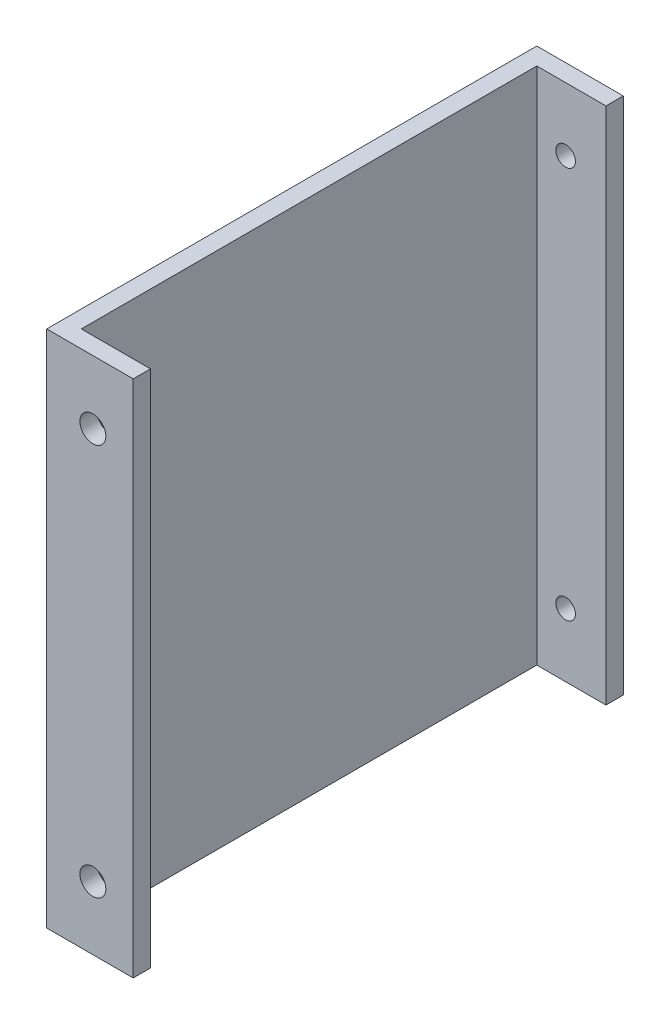
ISO-10303-21;
HEADER;
FILE_DESCRIPTION(('STEP AP214'),'2;1');
FILE_NAME('part.step','',(''),(''),'','','');
FILE_SCHEMA(('AUTOMOTIVE_DESIGN { 1 0 10303 214 1 1 1 1 }'));
ENDSEC;
DATA;
#1=APPLICATION_CONTEXT('core data for automotive mechanical design processes');
#2=APPLICATION_PROTOCOL_DEFINITION('international standard','automotive_design',2000,#1);
#3=PRODUCT_CONTEXT('',#1,'mechanical');
#4=PRODUCT('Part','Part','',(#3));
#5=PRODUCT_RELATED_PRODUCT_CATEGORY('part','',(#4));
#6=PRODUCT_DEFINITION_FORMATION('','',#4);
#7=PRODUCT_DEFINITION_CONTEXT('part definition',#1,'design');
#8=PRODUCT_DEFINITION('design','',#6,#7);
#9=PRODUCT_DEFINITION_SHAPE('','',#8);
#10=(LENGTH_UNIT() NAMED_UNIT(*) SI_UNIT(.MILLI.,.METRE.));
#11=(NAMED_UNIT(*) PLANE_ANGLE_UNIT() SI_UNIT($,.RADIAN.));
#12=(NAMED_UNIT(*) SI_UNIT($,.STERADIAN.) SOLID_ANGLE_UNIT());
#13=UNCERTAINTY_MEASURE_WITH_UNIT(LENGTH_MEASURE(1.E-05),#10,'distance_accuracy_value','');
#14=(GEOMETRIC_REPRESENTATION_CONTEXT(3) GLOBAL_UNCERTAINTY_ASSIGNED_CONTEXT((#13)) GLOBAL_UNIT_ASSIGNED_CONTEXT((#10,
#11,#12)) REPRESENTATION_CONTEXT('',''));
#15=CARTESIAN_POINT('',(0.,0.,0.));
#16=DIRECTION('',(0.,0.,1.));
#17=DIRECTION('',(1.,0.,0.));
#18=AXIS2_PLACEMENT_3D('',#15,#16,#17);
#19=CARTESIAN_POINT('',(-47.,-45.,9.));
#20=DIRECTION('',(0.,0.,1.));
#21=DIRECTION('',(1.,0.,0.));
#22=AXIS2_PLACEMENT_3D('',#19,#20,#21);
#23=PLANE('',#22);
#24=CARTESIAN_POINT('',(-42.,-34.,9.));
#25=DIRECTION('',(0.,0.,-1.));
#26=DIRECTION('',(-1.,0.,0.));
#27=AXIS2_PLACEMENT_3D('',#24,#25,#26);
#28=CIRCLE('',#27,1.7);
#29=CARTESIAN_POINT('',(-43.7,-34.,9.));
#30=VERTEX_POINT('',#29);
#31=EDGE_CURVE('E27',#30,#30,#28,.T.);
#32=ORIENTED_EDGE('',*,*,#31,.F.);
#33=EDGE_LOOP('',(#32));
#34=FACE_BOUND('',#33,.T.);
#35=CARTESIAN_POINT('',(-42.,34.,9.));
#36=DIRECTION('',(0.,0.,-1.));
#37=DIRECTION('',(-1.,0.,0.));
#38=AXIS2_PLACEMENT_3D('',#35,#36,#37);
#39=CIRCLE('',#38,1.7);
#40=CARTESIAN_POINT('',(-43.7,34.,9.));
#41=VERTEX_POINT('',#40);
#42=EDGE_CURVE('E48',#41,#41,#39,.T.);
#43=ORIENTED_EDGE('',*,*,#42,.F.);
#44=EDGE_LOOP('',(#43));
#45=FACE_BOUND('',#44,.T.);
#46=DIRECTION('',(1.,0.,0.));
#47=VECTOR('',#46,1.);
#48=CARTESIAN_POINT('',(-50.,45.,9.));
#49=LINE('',#48,#47);
#50=CARTESIAN_POINT('',(-50.,45.,9.));
#51=VERTEX_POINT('',#50);
#52=CARTESIAN_POINT('',(-35.,45.,9.));
#53=VERTEX_POINT('',#52);
#54=EDGE_CURVE('E149',#51,#53,#49,.T.);
#55=ORIENTED_EDGE('',*,*,#54,.T.);
#56=DIRECTION('',(0.,1.,0.));
#57=VECTOR('',#56,1.);
#58=CARTESIAN_POINT('',(-35.,-45.,9.));
#59=LINE('',#58,#57);
#60=CARTESIAN_POINT('',(-35.,-45.,9.));
#61=VERTEX_POINT('',#60);
#62=EDGE_CURVE('E11',#61,#53,#59,.T.);
#63=ORIENTED_EDGE('',*,*,#62,.F.);
#64=DIRECTION('',(1.,0.,0.));
#65=VECTOR('',#64,1.);
#66=CARTESIAN_POINT('',(-50.,-45.,9.));
#67=LINE('',#66,#65);
#68=CARTESIAN_POINT('',(-50.,-45.,9.));
#69=VERTEX_POINT('',#68);
#70=EDGE_CURVE('E272',#69,#61,#67,.T.);
#71=ORIENTED_EDGE('',*,*,#70,.F.);
#72=DIRECTION('',(0.,1.,0.));
#73=VECTOR('',#72,1.);
#74=CARTESIAN_POINT('',(-50.,-45.,9.));
#75=LINE('',#74,#73);
#76=EDGE_CURVE('E166',#69,#51,#75,.T.);
#77=ORIENTED_EDGE('',*,*,#76,.T.);
#78=EDGE_LOOP('',(#55,#63,#71,#77));
#79=FACE_BOUND('',#78,.T.);
#80=ADVANCED_FACE('F17',(#34,#45,#79),#23,.F.);
#81=CARTESIAN_POINT('',(-35.,-45.,9.));
#82=DIRECTION('',(-1.,0.,0.));
#83=DIRECTION('',(0.,0.,1.));
#84=AXIS2_PLACEMENT_3D('',#81,#82,#83);
#85=PLANE('',#84);
#86=DIRECTION('',(0.,0.,1.));
#87=VECTOR('',#86,1.);
#88=CARTESIAN_POINT('',(-35.,-45.,9.));
#89=LINE('',#88,#87);
#90=CARTESIAN_POINT('',(-35.,-45.,12.));
#91=VERTEX_POINT('',#90);
#92=EDGE_CURVE('E267',#61,#91,#89,.T.);
#93=ORIENTED_EDGE('',*,*,#92,.F.);
#94=ORIENTED_EDGE('',*,*,#62,.T.);
#95=DIRECTION('',(0.,0.,1.));
#96=VECTOR('',#95,1.);
#97=CARTESIAN_POINT('',(-35.,45.,9.));
#98=LINE('',#97,#96);
#99=CARTESIAN_POINT('',(-35.,45.,12.));
#100=VERTEX_POINT('',#99);
#101=EDGE_CURVE('E187',#53,#100,#98,.T.);
#102=ORIENTED_EDGE('',*,*,#101,.T.);
#103=DIRECTION('',(0.,1.,0.));
#104=VECTOR('',#103,1.);
#105=CARTESIAN_POINT('',(-35.,-45.,12.));
#106=LINE('',#105,#104);
#107=EDGE_CURVE('E221',#91,#100,#106,.T.);
#108=ORIENTED_EDGE('',*,*,#107,.F.);
#109=EDGE_LOOP('',(#93,#94,#102,#108));
#110=FACE_BOUND('',#109,.T.);
#111=ADVANCED_FACE('F19',(#110),#85,.F.);
#112=CARTESIAN_POINT('',(-42.,-34.,8.));
#113=DIRECTION('',(0.,0.,1.));
#114=DIRECTION('',(-1.,0.,0.));
#115=AXIS2_PLACEMENT_3D('',#112,#113,#114);
#116=CYLINDRICAL_SURFACE('',#115,1.7);
#117=CARTESIAN_POINT('',(-42.,-34.,12.));
#118=DIRECTION('',(0.,0.,-1.));
#119=DIRECTION('',(-1.,0.,0.));
#120=AXIS2_PLACEMENT_3D('',#117,#118,#119);
#121=CIRCLE('',#120,1.7);
#122=CARTESIAN_POINT('',(-43.7,-34.,12.));
#123=VERTEX_POINT('',#122);
#124=EDGE_CURVE('E224',#123,#123,#121,.T.);
#125=ORIENTED_EDGE('',*,*,#124,.F.);
#126=DIRECTION('',(0.,0.,1.));
#127=VECTOR('',#126,1.);
#128=CARTESIAN_POINT('',(-43.7,-34.,8.));
#129=LINE('',#128,#127);
#130=EDGE_CURVE('E21',#30,#123,#129,.T.);
#131=ORIENTED_EDGE('',*,*,#130,.F.);
#132=ORIENTED_EDGE('',*,*,#31,.T.);
#133=ORIENTED_EDGE('',*,*,#130,.T.);
#134=EDGE_LOOP('',(#125,#131,#132,#133));
#135=FACE_BOUND('',#134,.T.);
#136=ADVANCED_FACE('F239',(#135),#116,.F.);
#137=CARTESIAN_POINT('',(-42.,34.,8.));
#138=DIRECTION('',(0.,0.,1.));
#139=DIRECTION('',(-1.,0.,0.));
#140=AXIS2_PLACEMENT_3D('',#137,#138,#139);
#141=CYLINDRICAL_SURFACE('',#140,1.7);
#142=CARTESIAN_POINT('',(-42.,34.,12.));
#143=DIRECTION('',(0.,0.,-1.));
#144=DIRECTION('',(-1.,0.,0.));
#145=AXIS2_PLACEMENT_3D('',#142,#143,#144);
#146=CIRCLE('',#145,1.7);
#147=CARTESIAN_POINT('',(-43.7,34.,12.));
#148=VERTEX_POINT('',#147);
#149=EDGE_CURVE('E228',#148,#148,#146,.T.);
#150=ORIENTED_EDGE('',*,*,#149,.F.);
#151=DIRECTION('',(0.,0.,1.));
#152=VECTOR('',#151,1.);
#153=CARTESIAN_POINT('',(-43.7,34.,8.));
#154=LINE('',#153,#152);
#155=EDGE_CURVE('E229',#41,#148,#154,.T.);
#156=ORIENTED_EDGE('',*,*,#155,.F.);
#157=ORIENTED_EDGE('',*,*,#42,.T.);
#158=ORIENTED_EDGE('',*,*,#155,.T.);
#159=EDGE_LOOP('',(#150,#156,#157,#158));
#160=FACE_BOUND('',#159,.T.);
#161=ADVANCED_FACE('F245',(#160),#141,.F.);
#162=CARTESIAN_POINT('',(-35.,-45.,12.));
#163=DIRECTION('',(0.,0.,1.));
#164=DIRECTION('',(1.,0.,0.));
#165=AXIS2_PLACEMENT_3D('',#162,#163,#164);
#166=PLANE('',#165);
#167=ORIENTED_EDGE('',*,*,#149,.T.);
#168=EDGE_LOOP('',(#167));
#169=FACE_BOUND('',#168,.T.);
#170=ORIENTED_EDGE('',*,*,#124,.T.);
#171=EDGE_LOOP('',(#170));
#172=FACE_BOUND('',#171,.T.);
#173=DIRECTION('',(0.,-1.,0.));
#174=VECTOR('',#173,1.);
#175=CARTESIAN_POINT('',(-47.,-45.,12.));
#176=LINE('',#175,#174);
#177=CARTESIAN_POINT('',(-47.,45.,12.));
#178=VERTEX_POINT('',#177);
#179=CARTESIAN_POINT('',(-47.,-45.,12.));
#180=VERTEX_POINT('',#179);
#181=EDGE_CURVE('E218',#178,#180,#176,.T.);
#182=ORIENTED_EDGE('',*,*,#181,.T.);
#183=DIRECTION('',(-1.,0.,0.));
#184=VECTOR('',#183,1.);
#185=CARTESIAN_POINT('',(-35.,-45.,12.));
#186=LINE('',#185,#184);
#187=EDGE_CURVE('E251',#91,#180,#186,.T.);
#188=ORIENTED_EDGE('',*,*,#187,.F.);
#189=ORIENTED_EDGE('',*,*,#107,.T.);
#190=DIRECTION('',(-1.,0.,0.));
#191=VECTOR('',#190,1.);
#192=CARTESIAN_POINT('',(-35.,45.,12.));
#193=LINE('',#192,#191);
#194=EDGE_CURVE('E183',#100,#178,#193,.T.);
#195=ORIENTED_EDGE('',*,*,#194,.T.);
#196=EDGE_LOOP('',(#182,#188,#189,#195));
#197=FACE_BOUND('',#196,.T.);
#198=ADVANCED_FACE('F241',(#169,#172,#197),#166,.T.);
#199=CARTESIAN_POINT('',(-47.,-45.,9.));
#200=DIRECTION('',(-1.,0.,0.));
#201=DIRECTION('',(0.,0.,1.));
#202=AXIS2_PLACEMENT_3D('',#199,#200,#201);
#203=PLANE('',#202);
#204=DIRECTION('',(0.,0.,1.));
#205=VECTOR('',#204,1.);
#206=CARTESIAN_POINT('',(-47.,-45.,9.));
#207=LINE('',#206,#205);
#208=CARTESIAN_POINT('',(-47.,-45.,91.));
#209=VERTEX_POINT('',#208);
#210=EDGE_CURVE('E257',#180,#209,#207,.T.);
#211=ORIENTED_EDGE('',*,*,#210,.F.);
#212=ORIENTED_EDGE('',*,*,#181,.F.);
#213=DIRECTION('',(0.,0.,1.));
#214=VECTOR('',#213,1.);
#215=CARTESIAN_POINT('',(-47.,45.,9.));
#216=LINE('',#215,#214);
#217=CARTESIAN_POINT('',(-47.,45.,91.));
#218=VERTEX_POINT('',#217);
#219=EDGE_CURVE('E179',#178,#218,#216,.T.);
#220=ORIENTED_EDGE('',*,*,#219,.T.);
#221=DIRECTION('',(0.,-1.,0.));
#222=VECTOR('',#221,1.);
#223=CARTESIAN_POINT('',(-47.,-45.,91.));
#224=LINE('',#223,#222);
#225=EDGE_CURVE('E215',#218,#209,#224,.T.);
#226=ORIENTED_EDGE('',*,*,#225,.T.);
#227=EDGE_LOOP('',(#211,#212,#220,#226));
#228=FACE_BOUND('',#227,.T.);
#229=ADVANCED_FACE('F244',(#228),#203,.F.);
#230=CARTESIAN_POINT('',(-35.,-45.,91.));
#231=DIRECTION('',(0.,0.,1.));
#232=DIRECTION('',(1.,0.,0.));
#233=AXIS2_PLACEMENT_3D('',#230,#231,#232);
#234=PLANE('',#233);
#235=CARTESIAN_POINT('',(-42.,34.,91.));
#236=DIRECTION('',(0.,0.,-1.));
#237=DIRECTION('',(-1.,0.,0.));
#238=AXIS2_PLACEMENT_3D('',#235,#236,#237);
#239=CIRCLE('',#238,2.25);
#240=CARTESIAN_POINT('',(-44.25,34.,91.));
#241=VERTEX_POINT('',#240);
#242=EDGE_CURVE('E210',#241,#241,#239,.T.);
#243=ORIENTED_EDGE('',*,*,#242,.F.);
#244=EDGE_LOOP('',(#243));
#245=FACE_BOUND('',#244,.T.);
#246=CARTESIAN_POINT('',(-42.,-34.,91.));
#247=DIRECTION('',(0.,0.,-1.));
#248=DIRECTION('',(-1.,0.,0.));
#249=AXIS2_PLACEMENT_3D('',#246,#247,#248);
#250=CIRCLE('',#249,2.25);
#251=CARTESIAN_POINT('',(-44.25,-34.,91.));
#252=VERTEX_POINT('',#251);
#253=EDGE_CURVE('E201',#252,#252,#250,.T.);
#254=ORIENTED_EDGE('',*,*,#253,.F.);
#255=EDGE_LOOP('',(#254));
#256=FACE_BOUND('',#255,.T.);
#257=DIRECTION('',(-1.,0.,0.));
#258=VECTOR('',#257,1.);
#259=CARTESIAN_POINT('',(-35.,45.,91.));
#260=LINE('',#259,#258);
#261=CARTESIAN_POINT('',(-35.,45.,91.));
#262=VERTEX_POINT('',#261);
#263=EDGE_CURVE('E159',#262,#218,#260,.T.);
#264=ORIENTED_EDGE('',*,*,#263,.F.);
#265=DIRECTION('',(0.,1.,0.));
#266=VECTOR('',#265,1.);
#267=CARTESIAN_POINT('',(-35.,-45.,91.));
#268=LINE('',#267,#266);
#269=CARTESIAN_POINT('',(-35.,-45.,91.));
#270=VERTEX_POINT('',#269);
#271=EDGE_CURVE('E154',#270,#262,#268,.T.);
#272=ORIENTED_EDGE('',*,*,#271,.F.);
#273=DIRECTION('',(-1.,0.,0.));
#274=VECTOR('',#273,1.);
#275=CARTESIAN_POINT('',(-35.,-45.,91.));
#276=LINE('',#275,#274);
#277=EDGE_CURVE('E262',#270,#209,#276,.T.);
#278=ORIENTED_EDGE('',*,*,#277,.T.);
#279=ORIENTED_EDGE('',*,*,#225,.F.);
#280=EDGE_LOOP('',(#264,#272,#278,#279));
#281=FACE_BOUND('',#280,.T.);
#282=ADVANCED_FACE('F294',(#245,#256,#281),#234,.F.);
#283=CARTESIAN_POINT('',(-35.,-45.,91.));
#284=DIRECTION('',(-1.,0.,0.));
#285=DIRECTION('',(0.,0.,1.));
#286=AXIS2_PLACEMENT_3D('',#283,#284,#285);
#287=PLANE('',#286);
#288=DIRECTION('',(0.,0.,1.));
#289=VECTOR('',#288,1.);
#290=CARTESIAN_POINT('',(-35.,-45.,91.));
#291=LINE('',#290,#289);
#292=CARTESIAN_POINT('',(-35.,-45.,94.));
#293=VERTEX_POINT('',#292);
#294=EDGE_CURVE('E278',#270,#293,#291,.T.);
#295=ORIENTED_EDGE('',*,*,#294,.F.);
#296=ORIENTED_EDGE('',*,*,#271,.T.);
#297=DIRECTION('',(0.,0.,1.));
#298=VECTOR('',#297,1.);
#299=CARTESIAN_POINT('',(-35.,45.,91.));
#300=LINE('',#299,#298);
#301=CARTESIAN_POINT('',(-35.,45.,94.));
#302=VERTEX_POINT('',#301);
#303=EDGE_CURVE('E152',#262,#302,#300,.T.);
#304=ORIENTED_EDGE('',*,*,#303,.T.);
#305=DIRECTION('',(0.,1.,0.));
#306=VECTOR('',#305,1.);
#307=CARTESIAN_POINT('',(-35.,-45.,94.));
#308=LINE('',#307,#306);
#309=EDGE_CURVE('E136',#293,#302,#308,.T.);
#310=ORIENTED_EDGE('',*,*,#309,.F.);
#311=EDGE_LOOP('',(#295,#296,#304,#310));
#312=FACE_BOUND('',#311,.T.);
#313=ADVANCED_FACE('F153',(#312),#287,.F.);
#314=CARTESIAN_POINT('',(-42.,34.,90.));
#315=DIRECTION('',(0.,0.,1.));
#316=DIRECTION('',(-1.,0.,0.));
#317=AXIS2_PLACEMENT_3D('',#314,#315,#316);
#318=CYLINDRICAL_SURFACE('',#317,2.25);
#319=CARTESIAN_POINT('',(-42.,34.,94.));
#320=DIRECTION('',(0.,0.,-1.));
#321=DIRECTION('',(-1.,0.,0.));
#322=AXIS2_PLACEMENT_3D('',#319,#320,#321);
#323=CIRCLE('',#322,2.25);
#324=CARTESIAN_POINT('',(-44.25,34.,94.));
#325=VERTEX_POINT('',#324);
#326=EDGE_CURVE('E148',#325,#325,#323,.T.);
#327=ORIENTED_EDGE('',*,*,#326,.F.);
#328=DIRECTION('',(0.,0.,1.));
#329=VECTOR('',#328,1.);
#330=CARTESIAN_POINT('',(-44.25,34.,90.));
#331=LINE('',#330,#329);
#332=EDGE_CURVE('E206',#241,#325,#331,.T.);
#333=ORIENTED_EDGE('',*,*,#332,.F.);
#334=ORIENTED_EDGE('',*,*,#242,.T.);
#335=ORIENTED_EDGE('',*,*,#332,.T.);
#336=EDGE_LOOP('',(#327,#333,#334,#335));
#337=FACE_BOUND('',#336,.T.);
#338=ADVANCED_FACE('F326',(#337),#318,.F.);
#339=CARTESIAN_POINT('',(-42.,-34.,90.));
#340=DIRECTION('',(0.,0.,1.));
#341=DIRECTION('',(-1.,0.,0.));
#342=AXIS2_PLACEMENT_3D('',#339,#340,#341);
#343=CYLINDRICAL_SURFACE('',#342,2.25);
#344=CARTESIAN_POINT('',(-42.,-34.,94.));
#345=DIRECTION('',(0.,0.,-1.));
#346=DIRECTION('',(-1.,0.,0.));
#347=AXIS2_PLACEMENT_3D('',#344,#345,#346);
#348=CIRCLE('',#347,2.25);
#349=CARTESIAN_POINT('',(-44.25,-34.,94.));
#350=VERTEX_POINT('',#349);
#351=EDGE_CURVE('E197',#350,#350,#348,.T.);
#352=ORIENTED_EDGE('',*,*,#351,.F.);
#353=DIRECTION('',(0.,0.,1.));
#354=VECTOR('',#353,1.);
#355=CARTESIAN_POINT('',(-44.25,-34.,90.));
#356=LINE('',#355,#354);
#357=EDGE_CURVE('E198',#252,#350,#356,.T.);
#358=ORIENTED_EDGE('',*,*,#357,.F.);
#359=ORIENTED_EDGE('',*,*,#253,.T.);
#360=ORIENTED_EDGE('',*,*,#357,.T.);
#361=EDGE_LOOP('',(#352,#358,#359,#360));
#362=FACE_BOUND('',#361,.T.);
#363=ADVANCED_FACE('F323',(#362),#343,.F.);
#364=CARTESIAN_POINT('',(-47.,-45.,94.));
#365=DIRECTION('',(0.,0.,1.));
#366=DIRECTION('',(1.,0.,0.));
#367=AXIS2_PLACEMENT_3D('',#364,#365,#366);
#368=PLANE('',#367);
#369=ORIENTED_EDGE('',*,*,#351,.T.);
#370=EDGE_LOOP('',(#369));
#371=FACE_BOUND('',#370,.T.);
#372=ORIENTED_EDGE('',*,*,#326,.T.);
#373=EDGE_LOOP('',(#372));
#374=FACE_BOUND('',#373,.T.);
#375=DIRECTION('',(0.,1.,0.));
#376=VECTOR('',#375,1.);
#377=CARTESIAN_POINT('',(-50.,-45.,94.));
#378=LINE('',#377,#376);
#379=CARTESIAN_POINT('',(-50.,-45.,94.));
#380=VERTEX_POINT('',#379);
#381=CARTESIAN_POINT('',(-50.,45.,94.));
#382=VERTEX_POINT('',#381);
#383=EDGE_CURVE('E174',#380,#382,#378,.T.);
#384=ORIENTED_EDGE('',*,*,#383,.F.);
#385=DIRECTION('',(-1.,0.,0.));
#386=VECTOR('',#385,1.);
#387=CARTESIAN_POINT('',(-35.,-45.,94.));
#388=LINE('',#387,#386);
#389=EDGE_CURVE('E143',#293,#380,#388,.T.);
#390=ORIENTED_EDGE('',*,*,#389,.F.);
#391=ORIENTED_EDGE('',*,*,#309,.T.);
#392=DIRECTION('',(1.,0.,0.));
#393=VECTOR('',#392,1.);
#394=CARTESIAN_POINT('',(-50.,45.,94.));
#395=LINE('',#394,#393);
#396=EDGE_CURVE('E140',#382,#302,#395,.T.);
#397=ORIENTED_EDGE('',*,*,#396,.F.);
#398=EDGE_LOOP('',(#384,#390,#391,#397));
#399=FACE_BOUND('',#398,.T.);
#400=ADVANCED_FACE('F138',(#371,#374,#399),#368,.T.);
#401=CARTESIAN_POINT('',(-47.,45.,9.));
#402=DIRECTION('',(0.,1.,0.));
#403=DIRECTION('',(1.,0.,0.));
#404=AXIS2_PLACEMENT_3D('',#401,#402,#403);
#405=PLANE('',#404);
#406=DIRECTION('',(0.,0.,-1.));
#407=VECTOR('',#406,1.);
#408=CARTESIAN_POINT('',(-50.,45.,94.));
#409=LINE('',#408,#407);
#410=EDGE_CURVE('E163',#382,#51,#409,.T.);
#411=ORIENTED_EDGE('',*,*,#410,.F.);
#412=ORIENTED_EDGE('',*,*,#396,.T.);
#413=ORIENTED_EDGE('',*,*,#303,.F.);
#414=ORIENTED_EDGE('',*,*,#263,.T.);
#415=ORIENTED_EDGE('',*,*,#219,.F.);
#416=ORIENTED_EDGE('',*,*,#194,.F.);
#417=ORIENTED_EDGE('',*,*,#101,.F.);
#418=ORIENTED_EDGE('',*,*,#54,.F.);
#419=EDGE_LOOP('',(#411,#412,#413,#414,#415,#416,#417,#418));
#420=FACE_BOUND('',#419,.T.);
#421=ADVANCED_FACE('F161',(#420),#405,.T.);
#422=CARTESIAN_POINT('',(-50.,-45.,9.));
#423=DIRECTION('',(-1.,0.,0.));
#424=DIRECTION('',(0.,0.,1.));
#425=AXIS2_PLACEMENT_3D('',#422,#423,#424);
#426=PLANE('',#425);
#427=DIRECTION('',(0.,0.,-1.));
#428=VECTOR('',#427,1.);
#429=CARTESIAN_POINT('',(-50.,-45.,94.));
#430=LINE('',#429,#428);
#431=EDGE_CURVE('E279',#380,#69,#430,.T.);
#432=ORIENTED_EDGE('',*,*,#431,.F.);
#433=ORIENTED_EDGE('',*,*,#383,.T.);
#434=ORIENTED_EDGE('',*,*,#410,.T.);
#435=ORIENTED_EDGE('',*,*,#76,.F.);
#436=EDGE_LOOP('',(#432,#433,#434,#435));
#437=FACE_BOUND('',#436,.T.);
#438=ADVANCED_FACE('F291',(#437),#426,.T.);
#439=CARTESIAN_POINT('',(-47.,-45.,9.));
#440=DIRECTION('',(0.,1.,0.));
#441=DIRECTION('',(1.,0.,0.));
#442=AXIS2_PLACEMENT_3D('',#439,#440,#441);
#443=PLANE('',#442);
#444=ORIENTED_EDGE('',*,*,#70,.T.);
#445=ORIENTED_EDGE('',*,*,#92,.T.);
#446=ORIENTED_EDGE('',*,*,#187,.T.);
#447=ORIENTED_EDGE('',*,*,#210,.T.);
#448=ORIENTED_EDGE('',*,*,#277,.F.);
#449=ORIENTED_EDGE('',*,*,#294,.T.);
#450=ORIENTED_EDGE('',*,*,#389,.T.);
#451=ORIENTED_EDGE('',*,*,#431,.T.);
#452=EDGE_LOOP('',(#444,#445,#446,#447,#448,#449,#450,#451));
#453=FACE_BOUND('',#452,.T.);
#454=ADVANCED_FACE('F265',(#453),#443,.F.);
#455=CLOSED_SHELL('',(#80,#111,#136,#161,#198,#229,#282,#313,#338,#363,#400,#421,#438,#454));
#456=MANIFOLD_SOLID_BREP('B1',#455);
#457=ADVANCED_BREP_SHAPE_REPRESENTATION('',(#18,#456),#14);
#458=SHAPE_DEFINITION_REPRESENTATION(#9,#457);
ENDSEC;
END-ISO-10303-21;
